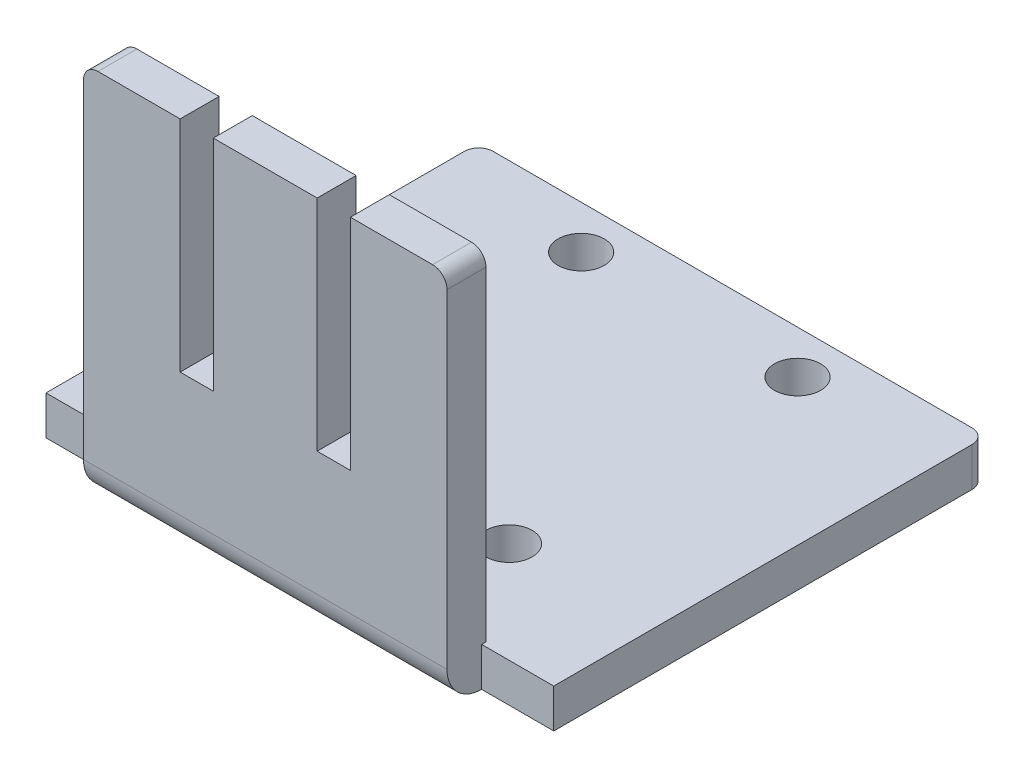
ISO-10303-21;
HEADER;
FILE_DESCRIPTION(('STEP AP214'),'2;1');
FILE_NAME('part.step','',(''),(''),'','','');
FILE_SCHEMA(('AUTOMOTIVE_DESIGN { 1 0 10303 214 1 1 1 1 }'));
ENDSEC;
DATA;
#1=APPLICATION_CONTEXT('core data for automotive mechanical design processes');
#2=APPLICATION_PROTOCOL_DEFINITION('international standard','automotive_design',2000,#1);
#3=PRODUCT_CONTEXT('',#1,'mechanical');
#4=PRODUCT('Part','Part','',(#3));
#5=PRODUCT_RELATED_PRODUCT_CATEGORY('part','',(#4));
#6=PRODUCT_DEFINITION_FORMATION('','',#4);
#7=PRODUCT_DEFINITION_CONTEXT('part definition',#1,'design');
#8=PRODUCT_DEFINITION('design','',#6,#7);
#9=PRODUCT_DEFINITION_SHAPE('','',#8);
#10=(LENGTH_UNIT() NAMED_UNIT(*) SI_UNIT(.MILLI.,.METRE.));
#11=(NAMED_UNIT(*) PLANE_ANGLE_UNIT() SI_UNIT($,.RADIAN.));
#12=(NAMED_UNIT(*) SI_UNIT($,.STERADIAN.) SOLID_ANGLE_UNIT());
#13=UNCERTAINTY_MEASURE_WITH_UNIT(LENGTH_MEASURE(1.E-05),#10,'distance_accuracy_value','');
#14=(GEOMETRIC_REPRESENTATION_CONTEXT(3) GLOBAL_UNCERTAINTY_ASSIGNED_CONTEXT((#13)) GLOBAL_UNIT_ASSIGNED_CONTEXT((#10,
#11,#12)) REPRESENTATION_CONTEXT('',''));
#15=CARTESIAN_POINT('',(0.,0.,0.));
#16=DIRECTION('',(0.,0.,1.));
#17=DIRECTION('',(1.,0.,0.));
#18=AXIS2_PLACEMENT_3D('',#15,#16,#17);
#19=CARTESIAN_POINT('',(17.6,-2.7,17.));
#20=DIRECTION('',(0.,0.,-1.));
#21=DIRECTION('',(0.,-1.,0.));
#22=AXIS2_PLACEMENT_3D('',#19,#20,#21);
#23=PLANE('',#22);
#24=DIRECTION('',(0.,-1.,0.));
#25=VECTOR('',#24,1.);
#26=CARTESIAN_POINT('',(-12.6,-2.7,17.));
#27=LINE('',#26,#25);
#28=CARTESIAN_POINT('',(-12.6,0.,17.));
#29=VERTEX_POINT('',#28);
#30=CARTESIAN_POINT('',(-12.6,-2.7,17.));
#31=VERTEX_POINT('',#30);
#32=EDGE_CURVE('E329',#29,#31,#27,.T.);
#33=ORIENTED_EDGE('',*,*,#32,.F.);
#34=DIRECTION('',(-1.,0.,0.));
#35=VECTOR('',#34,1.);
#36=CARTESIAN_POINT('',(17.6,0.,17.));
#37=LINE('',#36,#35);
#38=CARTESIAN_POINT('',(-17.6,0.,17.));
#39=VERTEX_POINT('',#38);
#40=EDGE_CURVE('E20',#29,#39,#37,.T.);
#41=ORIENTED_EDGE('',*,*,#40,.T.);
#42=DIRECTION('',(0.,1.,0.));
#43=VECTOR('',#42,1.);
#44=CARTESIAN_POINT('',(-17.6,-2.7,17.));
#45=LINE('',#44,#43);
#46=CARTESIAN_POINT('',(-17.6,-2.7,17.));
#47=VERTEX_POINT('',#46);
#48=EDGE_CURVE('E359',#47,#39,#45,.T.);
#49=ORIENTED_EDGE('',*,*,#48,.F.);
#50=DIRECTION('',(-1.,0.,0.));
#51=VECTOR('',#50,1.);
#52=CARTESIAN_POINT('',(17.6,-2.7,17.));
#53=LINE('',#52,#51);
#54=EDGE_CURVE('E344',#31,#47,#53,.T.);
#55=ORIENTED_EDGE('',*,*,#54,.F.);
#56=EDGE_LOOP('',(#33,#41,#49,#55));
#57=FACE_BOUND('',#56,.T.);
#58=ADVANCED_FACE('F17',(#57),#23,.F.);
#59=CARTESIAN_POINT('',(17.6,-2.7,17.));
#60=DIRECTION('',(0.,0.,-1.));
#61=DIRECTION('',(0.,-1.,0.));
#62=AXIS2_PLACEMENT_3D('',#59,#60,#61);
#63=PLANE('',#62);
#64=DIRECTION('',(0.,1.,0.));
#65=VECTOR('',#64,1.);
#66=CARTESIAN_POINT('',(12.6,-2.7,17.));
#67=LINE('',#66,#65);
#68=CARTESIAN_POINT('',(12.6,-2.7,17.));
#69=VERTEX_POINT('',#68);
#70=CARTESIAN_POINT('',(12.6,0.,17.));
#71=VERTEX_POINT('',#70);
#72=EDGE_CURVE('E259',#69,#71,#67,.T.);
#73=ORIENTED_EDGE('',*,*,#72,.F.);
#74=DIRECTION('',(-1.,0.,0.));
#75=VECTOR('',#74,1.);
#76=CARTESIAN_POINT('',(17.6,-2.7,17.));
#77=LINE('',#76,#75);
#78=CARTESIAN_POINT('',(17.6,-2.7,17.));
#79=VERTEX_POINT('',#78);
#80=EDGE_CURVE('E341',#79,#69,#77,.T.);
#81=ORIENTED_EDGE('',*,*,#80,.F.);
#82=DIRECTION('',(0.,1.,0.));
#83=VECTOR('',#82,1.);
#84=CARTESIAN_POINT('',(17.6,-2.7,17.));
#85=LINE('',#84,#83);
#86=CARTESIAN_POINT('',(17.6,0.,17.));
#87=VERTEX_POINT('',#86);
#88=EDGE_CURVE('E267',#79,#87,#85,.T.);
#89=ORIENTED_EDGE('',*,*,#88,.T.);
#90=DIRECTION('',(-1.,0.,0.));
#91=VECTOR('',#90,1.);
#92=CARTESIAN_POINT('',(17.6,0.,17.));
#93=LINE('',#92,#91);
#94=EDGE_CURVE('E11',#87,#71,#93,.T.);
#95=ORIENTED_EDGE('',*,*,#94,.T.);
#96=EDGE_LOOP('',(#73,#81,#89,#95));
#97=FACE_BOUND('',#96,.T.);
#98=ADVANCED_FACE('F453',(#97),#63,.F.);
#99=CARTESIAN_POINT('',(7.5,0.,-10.));
#100=DIRECTION('',(0.,-1.,0.));
#101=DIRECTION('',(0.,0.,-1.));
#102=AXIS2_PLACEMENT_3D('',#99,#100,#101);
#103=PLANE('',#102);
#104=CARTESIAN_POINT('',(7.5,0.,10.));
#105=DIRECTION('',(0.,-1.,0.));
#106=DIRECTION('',(1.,0.,0.));
#107=AXIS2_PLACEMENT_3D('',#104,#105,#106);
#108=CIRCLE('',#107,1.6);
#109=CARTESIAN_POINT('',(9.1,0.,10.));
#110=VERTEX_POINT('',#109);
#111=EDGE_CURVE('E469',#110,#110,#108,.T.);
#112=ORIENTED_EDGE('',*,*,#111,.T.);
#113=EDGE_LOOP('',(#112));
#114=FACE_BOUND('',#113,.T.);
#115=CARTESIAN_POINT('',(-7.5,0.,10.));
#116=DIRECTION('',(0.,-1.,0.));
#117=DIRECTION('',(1.,0.,0.));
#118=AXIS2_PLACEMENT_3D('',#115,#116,#117);
#119=CIRCLE('',#118,1.6);
#120=CARTESIAN_POINT('',(-5.9,0.,10.));
#121=VERTEX_POINT('',#120);
#122=EDGE_CURVE('E511',#121,#121,#119,.T.);
#123=ORIENTED_EDGE('',*,*,#122,.T.);
#124=EDGE_LOOP('',(#123));
#125=FACE_BOUND('',#124,.T.);
#126=CARTESIAN_POINT('',(-7.5,0.,-10.));
#127=DIRECTION('',(0.,-1.,0.));
#128=DIRECTION('',(1.,0.,0.));
#129=AXIS2_PLACEMENT_3D('',#126,#127,#128);
#130=CIRCLE('',#129,1.6);
#131=CARTESIAN_POINT('',(-5.9,0.,-10.));
#132=VERTEX_POINT('',#131);
#133=EDGE_CURVE('E510',#132,#132,#130,.T.);
#134=ORIENTED_EDGE('',*,*,#133,.T.);
#135=EDGE_LOOP('',(#134));
#136=FACE_BOUND('',#135,.T.);
#137=CARTESIAN_POINT('',(7.5,0.,-10.));
#138=DIRECTION('',(0.,-1.,0.));
#139=DIRECTION('',(1.,0.,0.));
#140=AXIS2_PLACEMENT_3D('',#137,#138,#139);
#141=CIRCLE('',#140,1.6);
#142=CARTESIAN_POINT('',(9.1,0.,-10.));
#143=VERTEX_POINT('',#142);
#144=EDGE_CURVE('E518',#143,#143,#141,.T.);
#145=ORIENTED_EDGE('',*,*,#144,.T.);
#146=EDGE_LOOP('',(#145));
#147=FACE_BOUND('',#146,.T.);
#148=DIRECTION('',(1.,0.,0.));
#149=VECTOR('',#148,1.);
#150=CARTESIAN_POINT('',(-17.6,0.,-13.));
#151=LINE('',#150,#149);
#152=CARTESIAN_POINT('',(-16.6,0.,-13.));
#153=VERTEX_POINT('',#152);
#154=CARTESIAN_POINT('',(16.6,0.,-13.));
#155=VERTEX_POINT('',#154);
#156=EDGE_CURVE('E270',#153,#155,#151,.T.);
#157=ORIENTED_EDGE('',*,*,#156,.F.);
#158=CARTESIAN_POINT('',(-16.6,0.,-12.));
#159=DIRECTION('',(0.,1.,0.));
#160=DIRECTION('',(0.,0.,-1.));
#161=AXIS2_PLACEMENT_3D('',#158,#159,#160);
#162=CIRCLE('',#161,1.);
#163=CARTESIAN_POINT('',(-17.6,0.,-12.));
#164=VERTEX_POINT('',#163);
#165=EDGE_CURVE('E403',#153,#164,#162,.T.);
#166=ORIENTED_EDGE('',*,*,#165,.T.);
#167=DIRECTION('',(0.,0.,-1.));
#168=VECTOR('',#167,1.);
#169=CARTESIAN_POINT('',(-17.6,0.,17.));
#170=LINE('',#169,#168);
#171=EDGE_CURVE('E351',#39,#164,#170,.T.);
#172=ORIENTED_EDGE('',*,*,#171,.F.);
#173=ORIENTED_EDGE('',*,*,#40,.F.);
#174=DIRECTION('',(0.,0.,1.));
#175=VECTOR('',#174,1.);
#176=CARTESIAN_POINT('',(-12.6,0.,-10.));
#177=LINE('',#176,#175);
#178=CARTESIAN_POINT('',(-12.6,0.,16.7));
#179=VERTEX_POINT('',#178);
#180=EDGE_CURVE('E258',#179,#29,#177,.T.);
#181=ORIENTED_EDGE('',*,*,#180,.F.);
#182=DIRECTION('',(-1.,0.,0.));
#183=VECTOR('',#182,1.);
#184=CARTESIAN_POINT('',(7.5,0.,16.7));
#185=LINE('',#184,#183);
#186=CARTESIAN_POINT('',(12.6,0.,16.7));
#187=VERTEX_POINT('',#186);
#188=EDGE_CURVE('E318',#187,#179,#185,.T.);
#189=ORIENTED_EDGE('',*,*,#188,.F.);
#190=DIRECTION('',(0.,0.,-1.));
#191=VECTOR('',#190,1.);
#192=CARTESIAN_POINT('',(12.6,0.,-10.));
#193=LINE('',#192,#191);
#194=EDGE_CURVE('E256',#71,#187,#193,.T.);
#195=ORIENTED_EDGE('',*,*,#194,.F.);
#196=ORIENTED_EDGE('',*,*,#94,.F.);
#197=DIRECTION('',(0.,0.,1.));
#198=VECTOR('',#197,1.);
#199=CARTESIAN_POINT('',(17.6,0.,-13.));
#200=LINE('',#199,#198);
#201=CARTESIAN_POINT('',(17.6,0.,-12.));
#202=VERTEX_POINT('',#201);
#203=EDGE_CURVE('E271',#202,#87,#200,.T.);
#204=ORIENTED_EDGE('',*,*,#203,.F.);
#205=CARTESIAN_POINT('',(16.6,0.,-12.));
#206=DIRECTION('',(0.,1.,0.));
#207=DIRECTION('',(0.,0.,-1.));
#208=AXIS2_PLACEMENT_3D('',#205,#206,#207);
#209=CIRCLE('',#208,1.);
#210=EDGE_CURVE('E384',#202,#155,#209,.T.);
#211=ORIENTED_EDGE('',*,*,#210,.T.);
#212=EDGE_LOOP('',(#157,#166,#172,#173,#181,#189,#195,#196,#204,#211));
#213=FACE_BOUND('',#212,.T.);
#214=ADVANCED_FACE('F542',(#114,#125,#136,#147,#213),#103,.F.);
#215=CARTESIAN_POINT('',(-17.6,-2.7,17.));
#216=DIRECTION('',(1.,0.,0.));
#217=DIRECTION('',(0.,0.,-1.));
#218=AXIS2_PLACEMENT_3D('',#215,#216,#217);
#219=PLANE('',#218);
#220=ORIENTED_EDGE('',*,*,#171,.T.);
#221=DIRECTION('',(0.,-1.,0.));
#222=VECTOR('',#221,1.);
#223=CARTESIAN_POINT('',(-17.6,-2.7,-12.));
#224=LINE('',#223,#222);
#225=CARTESIAN_POINT('',(-17.6,-2.7,-12.));
#226=VERTEX_POINT('',#225);
#227=EDGE_CURVE('E400',#164,#226,#224,.T.);
#228=ORIENTED_EDGE('',*,*,#227,.T.);
#229=DIRECTION('',(0.,0.,-1.));
#230=VECTOR('',#229,1.);
#231=CARTESIAN_POINT('',(-17.6,-2.7,17.));
#232=LINE('',#231,#230);
#233=EDGE_CURVE('E333',#47,#226,#232,.T.);
#234=ORIENTED_EDGE('',*,*,#233,.F.);
#235=ORIENTED_EDGE('',*,*,#48,.T.);
#236=EDGE_LOOP('',(#220,#228,#234,#235));
#237=FACE_BOUND('',#236,.T.);
#238=ADVANCED_FACE('F583',(#237),#219,.F.);
#239=CARTESIAN_POINT('',(-17.6,-2.7,-13.));
#240=DIRECTION('',(0.,0.,1.));
#241=DIRECTION('',(1.,0.,0.));
#242=AXIS2_PLACEMENT_3D('',#239,#240,#241);
#243=PLANE('',#242);
#244=DIRECTION('',(1.,0.,0.));
#245=VECTOR('',#244,1.);
#246=CARTESIAN_POINT('',(-17.6,-2.7,-13.));
#247=LINE('',#246,#245);
#248=CARTESIAN_POINT('',(-16.6,-2.7,-13.));
#249=VERTEX_POINT('',#248);
#250=CARTESIAN_POINT('',(16.6,-2.7,-13.));
#251=VERTEX_POINT('',#250);
#252=EDGE_CURVE('E336',#249,#251,#247,.T.);
#253=ORIENTED_EDGE('',*,*,#252,.F.);
#254=DIRECTION('',(0.,1.,0.));
#255=VECTOR('',#254,1.);
#256=CARTESIAN_POINT('',(-16.6,-2.7,-13.));
#257=LINE('',#256,#255);
#258=EDGE_CURVE('E406',#249,#153,#257,.T.);
#259=ORIENTED_EDGE('',*,*,#258,.T.);
#260=ORIENTED_EDGE('',*,*,#156,.T.);
#261=DIRECTION('',(0.,-1.,0.));
#262=VECTOR('',#261,1.);
#263=CARTESIAN_POINT('',(16.6,-2.7,-13.));
#264=LINE('',#263,#262);
#265=EDGE_CURVE('E381',#155,#251,#264,.T.);
#266=ORIENTED_EDGE('',*,*,#265,.T.);
#267=EDGE_LOOP('',(#253,#259,#260,#266));
#268=FACE_BOUND('',#267,.T.);
#269=ADVANCED_FACE('F604',(#268),#243,.F.);
#270=CARTESIAN_POINT('',(17.6,-2.7,-13.));
#271=DIRECTION('',(-1.,0.,0.));
#272=DIRECTION('',(0.,0.,1.));
#273=AXIS2_PLACEMENT_3D('',#270,#271,#272);
#274=PLANE('',#273);
#275=DIRECTION('',(0.,0.,1.));
#276=VECTOR('',#275,1.);
#277=CARTESIAN_POINT('',(17.6,-2.7,-13.));
#278=LINE('',#277,#276);
#279=CARTESIAN_POINT('',(17.6,-2.7,-12.));
#280=VERTEX_POINT('',#279);
#281=EDGE_CURVE('E337',#280,#79,#278,.T.);
#282=ORIENTED_EDGE('',*,*,#281,.F.);
#283=DIRECTION('',(0.,1.,0.));
#284=VECTOR('',#283,1.);
#285=CARTESIAN_POINT('',(17.6,-2.7,-12.));
#286=LINE('',#285,#284);
#287=EDGE_CURVE('E392',#280,#202,#286,.T.);
#288=ORIENTED_EDGE('',*,*,#287,.T.);
#289=ORIENTED_EDGE('',*,*,#203,.T.);
#290=ORIENTED_EDGE('',*,*,#88,.F.);
#291=EDGE_LOOP('',(#282,#288,#289,#290));
#292=FACE_BOUND('',#291,.T.);
#293=ADVANCED_FACE('F554',(#292),#274,.F.);
#294=CARTESIAN_POINT('',(7.5,-2.7,-10.));
#295=DIRECTION('',(0.,-1.,0.));
#296=DIRECTION('',(0.,0.,-1.));
#297=AXIS2_PLACEMENT_3D('',#294,#295,#296);
#298=PLANE('',#297);
#299=CARTESIAN_POINT('',(7.5,-2.7,-10.));
#300=DIRECTION('',(0.,-1.,0.));
#301=DIRECTION('',(1.,0.,0.));
#302=AXIS2_PLACEMENT_3D('',#299,#300,#301);
#303=CIRCLE('',#302,1.6);
#304=CARTESIAN_POINT('',(9.1,-2.7,-10.));
#305=VERTEX_POINT('',#304);
#306=EDGE_CURVE('E527',#305,#305,#303,.T.);
#307=ORIENTED_EDGE('',*,*,#306,.F.);
#308=EDGE_LOOP('',(#307));
#309=FACE_BOUND('',#308,.T.);
#310=CARTESIAN_POINT('',(-7.5,-2.7,-10.));
#311=DIRECTION('',(0.,-1.,0.));
#312=DIRECTION('',(1.,0.,0.));
#313=AXIS2_PLACEMENT_3D('',#310,#311,#312);
#314=CIRCLE('',#313,1.6);
#315=CARTESIAN_POINT('',(-5.9,-2.7,-10.));
#316=VERTEX_POINT('',#315);
#317=EDGE_CURVE('E506',#316,#316,#314,.T.);
#318=ORIENTED_EDGE('',*,*,#317,.F.);
#319=EDGE_LOOP('',(#318));
#320=FACE_BOUND('',#319,.T.);
#321=CARTESIAN_POINT('',(-7.5,-2.7,10.));
#322=DIRECTION('',(0.,-1.,0.));
#323=DIRECTION('',(1.,0.,0.));
#324=AXIS2_PLACEMENT_3D('',#321,#322,#323);
#325=CIRCLE('',#324,1.6);
#326=CARTESIAN_POINT('',(-5.9,-2.7,10.));
#327=VERTEX_POINT('',#326);
#328=EDGE_CURVE('E561',#327,#327,#325,.T.);
#329=ORIENTED_EDGE('',*,*,#328,.F.);
#330=EDGE_LOOP('',(#329));
#331=FACE_BOUND('',#330,.T.);
#332=CARTESIAN_POINT('',(7.5,-2.7,10.));
#333=DIRECTION('',(0.,-1.,0.));
#334=DIRECTION('',(1.,0.,0.));
#335=AXIS2_PLACEMENT_3D('',#332,#333,#334);
#336=CIRCLE('',#335,1.6);
#337=CARTESIAN_POINT('',(9.1,-2.7,10.));
#338=VERTEX_POINT('',#337);
#339=EDGE_CURVE('E476',#338,#338,#336,.T.);
#340=ORIENTED_EDGE('',*,*,#339,.F.);
#341=EDGE_LOOP('',(#340));
#342=FACE_BOUND('',#341,.T.);
#343=ORIENTED_EDGE('',*,*,#233,.T.);
#344=CARTESIAN_POINT('',(-16.6,-2.7,-12.));
#345=DIRECTION('',(0.,-1.,0.));
#346=DIRECTION('',(0.,0.,-1.));
#347=AXIS2_PLACEMENT_3D('',#344,#345,#346);
#348=CIRCLE('',#347,1.);
#349=EDGE_CURVE('E396',#226,#249,#348,.T.);
#350=ORIENTED_EDGE('',*,*,#349,.T.);
#351=ORIENTED_EDGE('',*,*,#252,.T.);
#352=CARTESIAN_POINT('',(16.6,-2.7,-12.));
#353=DIRECTION('',(0.,-1.,0.));
#354=DIRECTION('',(0.,0.,-1.));
#355=AXIS2_PLACEMENT_3D('',#352,#353,#354);
#356=CIRCLE('',#355,1.);
#357=EDGE_CURVE('E377',#251,#280,#356,.T.);
#358=ORIENTED_EDGE('',*,*,#357,.T.);
#359=ORIENTED_EDGE('',*,*,#281,.T.);
#360=ORIENTED_EDGE('',*,*,#80,.T.);
#361=DIRECTION('',(-1.,0.,0.));
#362=VECTOR('',#361,1.);
#363=CARTESIAN_POINT('',(7.5,-2.7,17.));
#364=LINE('',#363,#362);
#365=EDGE_CURVE('E413',#69,#31,#364,.T.);
#366=ORIENTED_EDGE('',*,*,#365,.T.);
#367=ORIENTED_EDGE('',*,*,#54,.T.);
#368=EDGE_LOOP('',(#343,#350,#351,#358,#359,#360,#366,#367));
#369=FACE_BOUND('',#368,.T.);
#370=ADVANCED_FACE('F447',(#309,#320,#331,#342,#369),#298,.T.);
#371=CARTESIAN_POINT('',(-12.6,23.5,19.4));
#372=DIRECTION('',(1.,0.,0.));
#373=DIRECTION('',(0.,1.,0.));
#374=AXIS2_PLACEMENT_3D('',#371,#372,#373);
#375=PLANE('',#374);
#376=DIRECTION('',(0.,-1.,0.));
#377=VECTOR('',#376,1.);
#378=CARTESIAN_POINT('',(-12.6,23.5,19.4));
#379=LINE('',#378,#377);
#380=CARTESIAN_POINT('',(-12.6,22.5,19.4));
#381=VERTEX_POINT('',#380);
#382=CARTESIAN_POINT('',(-12.6,-0.3,19.4));
#383=VERTEX_POINT('',#382);
#384=EDGE_CURVE('E251',#381,#383,#379,.T.);
#385=ORIENTED_EDGE('',*,*,#384,.F.);
#386=DIRECTION('',(0.,0.,-1.));
#387=VECTOR('',#386,1.);
#388=CARTESIAN_POINT('',(-12.6,22.5,19.4));
#389=LINE('',#388,#387);
#390=CARTESIAN_POINT('',(-12.6,22.5,16.7));
#391=VERTEX_POINT('',#390);
#392=EDGE_CURVE('E373',#381,#391,#389,.T.);
#393=ORIENTED_EDGE('',*,*,#392,.T.);
#394=DIRECTION('',(0.,-1.,0.));
#395=VECTOR('',#394,1.);
#396=CARTESIAN_POINT('',(-12.6,23.5,16.7));
#397=LINE('',#396,#395);
#398=EDGE_CURVE('E317',#391,#179,#397,.T.);
#399=ORIENTED_EDGE('',*,*,#398,.T.);
#400=ORIENTED_EDGE('',*,*,#180,.T.);
#401=ORIENTED_EDGE('',*,*,#32,.T.);
#402=CARTESIAN_POINT('',(-12.6,-0.3,17.));
#403=DIRECTION('',(-1.,0.,0.));
#404=DIRECTION('',(0.,1.,0.));
#405=AXIS2_PLACEMENT_3D('',#402,#403,#404);
#406=CIRCLE('',#405,2.4);
#407=EDGE_CURVE('E409',#31,#383,#406,.T.);
#408=ORIENTED_EDGE('',*,*,#407,.T.);
#409=EDGE_LOOP('',(#385,#393,#399,#400,#401,#408));
#410=FACE_BOUND('',#409,.T.);
#411=ADVANCED_FACE('F445',(#410),#375,.F.);
#412=CARTESIAN_POINT('',(12.6,-2.7,19.4));
#413=DIRECTION('',(-1.,0.,0.));
#414=DIRECTION('',(0.,0.,1.));
#415=AXIS2_PLACEMENT_3D('',#412,#413,#414);
#416=PLANE('',#415);
#417=DIRECTION('',(0.,1.,0.));
#418=VECTOR('',#417,1.);
#419=CARTESIAN_POINT('',(12.6,-2.7,16.7));
#420=LINE('',#419,#418);
#421=CARTESIAN_POINT('',(12.6,22.5,16.7));
#422=VERTEX_POINT('',#421);
#423=EDGE_CURVE('E322',#187,#422,#420,.T.);
#424=ORIENTED_EDGE('',*,*,#423,.T.);
#425=DIRECTION('',(0.,0.,1.));
#426=VECTOR('',#425,1.);
#427=CARTESIAN_POINT('',(12.6,22.5,19.4));
#428=LINE('',#427,#426);
#429=CARTESIAN_POINT('',(12.6,22.5,19.4));
#430=VERTEX_POINT('',#429);
#431=EDGE_CURVE('E458',#422,#430,#428,.T.);
#432=ORIENTED_EDGE('',*,*,#431,.T.);
#433=DIRECTION('',(0.,1.,0.));
#434=VECTOR('',#433,1.);
#435=CARTESIAN_POINT('',(12.6,-2.7,19.4));
#436=LINE('',#435,#434);
#437=CARTESIAN_POINT('',(12.6,-0.3,19.4));
#438=VERTEX_POINT('',#437);
#439=EDGE_CURVE('E245',#438,#430,#436,.T.);
#440=ORIENTED_EDGE('',*,*,#439,.F.);
#441=CARTESIAN_POINT('',(12.6,-0.3,17.));
#442=DIRECTION('',(1.,0.,0.));
#443=DIRECTION('',(0.,-1.,0.));
#444=AXIS2_PLACEMENT_3D('',#441,#442,#443);
#445=CIRCLE('',#444,2.4);
#446=EDGE_CURVE('E417',#438,#69,#445,.T.);
#447=ORIENTED_EDGE('',*,*,#446,.T.);
#448=ORIENTED_EDGE('',*,*,#72,.T.);
#449=ORIENTED_EDGE('',*,*,#194,.T.);
#450=EDGE_LOOP('',(#424,#432,#440,#447,#448,#449));
#451=FACE_BOUND('',#450,.T.);
#452=ADVANCED_FACE('F455',(#451),#416,.F.);
#453=CARTESIAN_POINT('',(0.,0.,16.7));
#454=DIRECTION('',(0.,0.,1.));
#455=DIRECTION('',(1.,0.,0.));
#456=AXIS2_PLACEMENT_3D('',#453,#454,#455);
#457=PLANE('',#456);
#458=ORIENTED_EDGE('',*,*,#398,.F.);
#459=CARTESIAN_POINT('',(-11.6,22.5,16.7));
#460=DIRECTION('',(0.,0.,-1.));
#461=DIRECTION('',(1.,0.,0.));
#462=AXIS2_PLACEMENT_3D('',#459,#460,#461);
#463=CIRCLE('',#462,1.);
#464=CARTESIAN_POINT('',(-11.6,23.5,16.7));
#465=VERTEX_POINT('',#464);
#466=EDGE_CURVE('E378',#391,#465,#463,.T.);
#467=ORIENTED_EDGE('',*,*,#466,.T.);
#468=DIRECTION('',(-1.,0.,0.));
#469=VECTOR('',#468,1.);
#470=CARTESIAN_POINT('',(-5.9,23.5,16.7));
#471=LINE('',#470,#469);
#472=CARTESIAN_POINT('',(-5.9,23.5,16.7));
#473=VERTEX_POINT('',#472);
#474=EDGE_CURVE('E255',#473,#465,#471,.T.);
#475=ORIENTED_EDGE('',*,*,#474,.F.);
#476=DIRECTION('',(0.,1.,0.));
#477=VECTOR('',#476,1.);
#478=CARTESIAN_POINT('',(-5.9,8.3,16.7));
#479=LINE('',#478,#477);
#480=CARTESIAN_POINT('',(-5.9,8.3,16.7));
#481=VERTEX_POINT('',#480);
#482=EDGE_CURVE('E280',#481,#473,#479,.T.);
#483=ORIENTED_EDGE('',*,*,#482,.F.);
#484=DIRECTION('',(-1.,0.,0.));
#485=VECTOR('',#484,1.);
#486=CARTESIAN_POINT('',(-3.6,8.3,16.7));
#487=LINE('',#486,#485);
#488=CARTESIAN_POINT('',(-3.6,8.3,16.7));
#489=VERTEX_POINT('',#488);
#490=EDGE_CURVE('E285',#489,#481,#487,.T.);
#491=ORIENTED_EDGE('',*,*,#490,.F.);
#492=DIRECTION('',(0.,-1.,0.));
#493=VECTOR('',#492,1.);
#494=CARTESIAN_POINT('',(-3.6,23.5,16.7));
#495=LINE('',#494,#493);
#496=CARTESIAN_POINT('',(-3.6,23.5,16.7));
#497=VERTEX_POINT('',#496);
#498=EDGE_CURVE('E292',#497,#489,#495,.T.);
#499=ORIENTED_EDGE('',*,*,#498,.F.);
#500=DIRECTION('',(-1.,0.,0.));
#501=VECTOR('',#500,1.);
#502=CARTESIAN_POINT('',(3.6,23.5,16.7));
#503=LINE('',#502,#501);
#504=CARTESIAN_POINT('',(3.6,23.5,16.7));
#505=VERTEX_POINT('',#504);
#506=EDGE_CURVE('E296',#505,#497,#503,.T.);
#507=ORIENTED_EDGE('',*,*,#506,.F.);
#508=DIRECTION('',(0.,1.,0.));
#509=VECTOR('',#508,1.);
#510=CARTESIAN_POINT('',(3.6,8.3,16.7));
#511=LINE('',#510,#509);
#512=CARTESIAN_POINT('',(3.6,8.3,16.7));
#513=VERTEX_POINT('',#512);
#514=EDGE_CURVE('E303',#513,#505,#511,.T.);
#515=ORIENTED_EDGE('',*,*,#514,.F.);
#516=DIRECTION('',(-1.,0.,0.));
#517=VECTOR('',#516,1.);
#518=CARTESIAN_POINT('',(5.9,8.3,16.7));
#519=LINE('',#518,#517);
#520=CARTESIAN_POINT('',(5.9,8.3,16.7));
#521=VERTEX_POINT('',#520);
#522=EDGE_CURVE('E310',#521,#513,#519,.T.);
#523=ORIENTED_EDGE('',*,*,#522,.F.);
#524=DIRECTION('',(0.,-1.,0.));
#525=VECTOR('',#524,1.);
#526=CARTESIAN_POINT('',(5.9,23.5,16.7));
#527=LINE('',#526,#525);
#528=CARTESIAN_POINT('',(5.9,23.5,16.7));
#529=VERTEX_POINT('',#528);
#530=EDGE_CURVE('E227',#529,#521,#527,.T.);
#531=ORIENTED_EDGE('',*,*,#530,.F.);
#532=DIRECTION('',(-1.,0.,0.));
#533=VECTOR('',#532,1.);
#534=CARTESIAN_POINT('',(12.6,23.5,16.7));
#535=LINE('',#534,#533);
#536=CARTESIAN_POINT('',(11.6,23.5,16.7));
#537=VERTEX_POINT('',#536);
#538=EDGE_CURVE('E223',#537,#529,#535,.T.);
#539=ORIENTED_EDGE('',*,*,#538,.F.);
#540=CARTESIAN_POINT('',(11.6,22.5,16.7));
#541=DIRECTION('',(0.,0.,-1.));
#542=DIRECTION('',(1.,0.,0.));
#543=AXIS2_PLACEMENT_3D('',#540,#541,#542);
#544=CIRCLE('',#543,1.);
#545=EDGE_CURVE('E464',#537,#422,#544,.T.);
#546=ORIENTED_EDGE('',*,*,#545,.T.);
#547=ORIENTED_EDGE('',*,*,#423,.F.);
#548=ORIENTED_EDGE('',*,*,#188,.T.);
#549=EDGE_LOOP('',(#458,#467,#475,#483,#491,#499,#507,#515,#523,#531,#539,#546,#547,#548));
#550=FACE_BOUND('',#549,.T.);
#551=ADVANCED_FACE('F595',(#550),#457,.F.);
#552=CARTESIAN_POINT('',(12.6,23.5,19.4));
#553=DIRECTION('',(0.,-1.,0.));
#554=DIRECTION('',(0.,0.,-1.));
#555=AXIS2_PLACEMENT_3D('',#552,#553,#554);
#556=PLANE('',#555);
#557=DIRECTION('',(-1.,0.,0.));
#558=VECTOR('',#557,1.);
#559=CARTESIAN_POINT('',(12.6,23.5,19.4));
#560=LINE('',#559,#558);
#561=CARTESIAN_POINT('',(11.6,23.5,19.4));
#562=VERTEX_POINT('',#561);
#563=CARTESIAN_POINT('',(5.9,23.5,19.4));
#564=VERTEX_POINT('',#563);
#565=EDGE_CURVE('E221',#562,#564,#560,.T.);
#566=ORIENTED_EDGE('',*,*,#565,.F.);
#567=DIRECTION('',(0.,0.,-1.));
#568=VECTOR('',#567,1.);
#569=CARTESIAN_POINT('',(11.6,23.5,19.4));
#570=LINE('',#569,#568);
#571=EDGE_CURVE('E467',#562,#537,#570,.T.);
#572=ORIENTED_EDGE('',*,*,#571,.T.);
#573=ORIENTED_EDGE('',*,*,#538,.T.);
#574=DIRECTION('',(0.,0.,-1.));
#575=VECTOR('',#574,1.);
#576=CARTESIAN_POINT('',(5.9,23.5,19.4));
#577=LINE('',#576,#575);
#578=EDGE_CURVE('E216',#564,#529,#577,.T.);
#579=ORIENTED_EDGE('',*,*,#578,.F.);
#580=EDGE_LOOP('',(#566,#572,#573,#579));
#581=FACE_BOUND('',#580,.T.);
#582=ADVANCED_FACE('F218',(#581),#556,.F.);
#583=CARTESIAN_POINT('',(5.9,23.5,19.4));
#584=DIRECTION('',(1.,0.,0.));
#585=DIRECTION('',(0.,1.,0.));
#586=AXIS2_PLACEMENT_3D('',#583,#584,#585);
#587=PLANE('',#586);
#588=ORIENTED_EDGE('',*,*,#530,.T.);
#589=DIRECTION('',(0.,0.,-1.));
#590=VECTOR('',#589,1.);
#591=CARTESIAN_POINT('',(5.9,8.3,19.4));
#592=LINE('',#591,#590);
#593=CARTESIAN_POINT('',(5.9,8.3,19.4));
#594=VERTEX_POINT('',#593);
#595=EDGE_CURVE('E233',#594,#521,#592,.T.);
#596=ORIENTED_EDGE('',*,*,#595,.F.);
#597=DIRECTION('',(0.,-1.,0.));
#598=VECTOR('',#597,1.);
#599=CARTESIAN_POINT('',(5.9,23.5,19.4));
#600=LINE('',#599,#598);
#601=EDGE_CURVE('E230',#564,#594,#600,.T.);
#602=ORIENTED_EDGE('',*,*,#601,.F.);
#603=ORIENTED_EDGE('',*,*,#578,.T.);
#604=EDGE_LOOP('',(#588,#596,#602,#603));
#605=FACE_BOUND('',#604,.T.);
#606=ADVANCED_FACE('F231',(#605),#587,.F.);
#607=CARTESIAN_POINT('',(5.9,8.3,19.4));
#608=DIRECTION('',(0.,-1.,0.));
#609=DIRECTION('',(0.,0.,-1.));
#610=AXIS2_PLACEMENT_3D('',#607,#608,#609);
#611=PLANE('',#610);
#612=ORIENTED_EDGE('',*,*,#522,.T.);
#613=DIRECTION('',(0.,0.,-1.));
#614=VECTOR('',#613,1.);
#615=CARTESIAN_POINT('',(3.6,8.3,19.4));
#616=LINE('',#615,#614);
#617=CARTESIAN_POINT('',(3.6,8.3,19.4));
#618=VERTEX_POINT('',#617);
#619=EDGE_CURVE('E306',#618,#513,#616,.T.);
#620=ORIENTED_EDGE('',*,*,#619,.F.);
#621=DIRECTION('',(-1.,0.,0.));
#622=VECTOR('',#621,1.);
#623=CARTESIAN_POINT('',(5.9,8.3,19.4));
#624=LINE('',#623,#622);
#625=EDGE_CURVE('E238',#594,#618,#624,.T.);
#626=ORIENTED_EDGE('',*,*,#625,.F.);
#627=ORIENTED_EDGE('',*,*,#595,.T.);
#628=EDGE_LOOP('',(#612,#620,#626,#627));
#629=FACE_BOUND('',#628,.T.);
#630=ADVANCED_FACE('F588',(#629),#611,.F.);
#631=CARTESIAN_POINT('',(3.6,8.3,19.4));
#632=DIRECTION('',(-1.,0.,0.));
#633=DIRECTION('',(0.,0.,1.));
#634=AXIS2_PLACEMENT_3D('',#631,#632,#633);
#635=PLANE('',#634);
#636=ORIENTED_EDGE('',*,*,#514,.T.);
#637=DIRECTION('',(0.,0.,-1.));
#638=VECTOR('',#637,1.);
#639=CARTESIAN_POINT('',(3.6,23.5,19.4));
#640=LINE('',#639,#638);
#641=CARTESIAN_POINT('',(3.6,23.5,19.4));
#642=VERTEX_POINT('',#641);
#643=EDGE_CURVE('E299',#642,#505,#640,.T.);
#644=ORIENTED_EDGE('',*,*,#643,.F.);
#645=DIRECTION('',(0.,1.,0.));
#646=VECTOR('',#645,1.);
#647=CARTESIAN_POINT('',(3.6,8.3,19.4));
#648=LINE('',#647,#646);
#649=EDGE_CURVE('E265',#618,#642,#648,.T.);
#650=ORIENTED_EDGE('',*,*,#649,.F.);
#651=ORIENTED_EDGE('',*,*,#619,.T.);
#652=EDGE_LOOP('',(#636,#644,#650,#651));
#653=FACE_BOUND('',#652,.T.);
#654=ADVANCED_FACE('F591',(#653),#635,.F.);
#655=CARTESIAN_POINT('',(3.6,23.5,19.4));
#656=DIRECTION('',(0.,-1.,0.));
#657=DIRECTION('',(0.,0.,-1.));
#658=AXIS2_PLACEMENT_3D('',#655,#656,#657);
#659=PLANE('',#658);
#660=ORIENTED_EDGE('',*,*,#506,.T.);
#661=DIRECTION('',(0.,0.,-1.));
#662=VECTOR('',#661,1.);
#663=CARTESIAN_POINT('',(-3.6,23.5,19.4));
#664=LINE('',#663,#662);
#665=CARTESIAN_POINT('',(-3.6,23.5,19.4));
#666=VERTEX_POINT('',#665);
#667=EDGE_CURVE('E295',#666,#497,#664,.T.);
#668=ORIENTED_EDGE('',*,*,#667,.F.);
#669=DIRECTION('',(-1.,0.,0.));
#670=VECTOR('',#669,1.);
#671=CARTESIAN_POINT('',(3.6,23.5,19.4));
#672=LINE('',#671,#670);
#673=EDGE_CURVE('E261',#642,#666,#672,.T.);
#674=ORIENTED_EDGE('',*,*,#673,.F.);
#675=ORIENTED_EDGE('',*,*,#643,.T.);
#676=EDGE_LOOP('',(#660,#668,#674,#675));
#677=FACE_BOUND('',#676,.T.);
#678=ADVANCED_FACE('F670',(#677),#659,.F.);
#679=CARTESIAN_POINT('',(-3.6,23.5,19.4));
#680=DIRECTION('',(1.,0.,0.));
#681=DIRECTION('',(0.,1.,0.));
#682=AXIS2_PLACEMENT_3D('',#679,#680,#681);
#683=PLANE('',#682);
#684=ORIENTED_EDGE('',*,*,#498,.T.);
#685=DIRECTION('',(0.,0.,-1.));
#686=VECTOR('',#685,1.);
#687=CARTESIAN_POINT('',(-3.6,8.3,19.4));
#688=LINE('',#687,#686);
#689=CARTESIAN_POINT('',(-3.6,8.3,19.4));
#690=VERTEX_POINT('',#689);
#691=EDGE_CURVE('E288',#690,#489,#688,.T.);
#692=ORIENTED_EDGE('',*,*,#691,.F.);
#693=DIRECTION('',(0.,-1.,0.));
#694=VECTOR('',#693,1.);
#695=CARTESIAN_POINT('',(-3.6,23.5,19.4));
#696=LINE('',#695,#694);
#697=EDGE_CURVE('E264',#666,#690,#696,.T.);
#698=ORIENTED_EDGE('',*,*,#697,.F.);
#699=ORIENTED_EDGE('',*,*,#667,.T.);
#700=EDGE_LOOP('',(#684,#692,#698,#699));
#701=FACE_BOUND('',#700,.T.);
#702=ADVANCED_FACE('F678',(#701),#683,.F.);
#703=CARTESIAN_POINT('',(-3.6,8.3,19.4));
#704=DIRECTION('',(0.,-1.,0.));
#705=DIRECTION('',(0.,0.,-1.));
#706=AXIS2_PLACEMENT_3D('',#703,#704,#705);
#707=PLANE('',#706);
#708=ORIENTED_EDGE('',*,*,#490,.T.);
#709=DIRECTION('',(0.,0.,-1.));
#710=VECTOR('',#709,1.);
#711=CARTESIAN_POINT('',(-5.9,8.3,19.4));
#712=LINE('',#711,#710);
#713=CARTESIAN_POINT('',(-5.9,8.3,19.4));
#714=VERTEX_POINT('',#713);
#715=EDGE_CURVE('E283',#714,#481,#712,.T.);
#716=ORIENTED_EDGE('',*,*,#715,.F.);
#717=DIRECTION('',(-1.,0.,0.));
#718=VECTOR('',#717,1.);
#719=CARTESIAN_POINT('',(-3.6,8.3,19.4));
#720=LINE('',#719,#718);
#721=EDGE_CURVE('E275',#690,#714,#720,.T.);
#722=ORIENTED_EDGE('',*,*,#721,.F.);
#723=ORIENTED_EDGE('',*,*,#691,.T.);
#724=EDGE_LOOP('',(#708,#716,#722,#723));
#725=FACE_BOUND('',#724,.T.);
#726=ADVANCED_FACE('F687',(#725),#707,.F.);
#727=CARTESIAN_POINT('',(-5.9,8.3,19.4));
#728=DIRECTION('',(-1.,0.,0.));
#729=DIRECTION('',(0.,0.,1.));
#730=AXIS2_PLACEMENT_3D('',#727,#728,#729);
#731=PLANE('',#730);
#732=ORIENTED_EDGE('',*,*,#482,.T.);
#733=DIRECTION('',(0.,0.,-1.));
#734=VECTOR('',#733,1.);
#735=CARTESIAN_POINT('',(-5.9,23.5,19.4));
#736=LINE('',#735,#734);
#737=CARTESIAN_POINT('',(-5.9,23.5,19.4));
#738=VERTEX_POINT('',#737);
#739=EDGE_CURVE('E284',#738,#473,#736,.T.);
#740=ORIENTED_EDGE('',*,*,#739,.F.);
#741=DIRECTION('',(0.,1.,0.));
#742=VECTOR('',#741,1.);
#743=CARTESIAN_POINT('',(-5.9,8.3,19.4));
#744=LINE('',#743,#742);
#745=EDGE_CURVE('E276',#714,#738,#744,.T.);
#746=ORIENTED_EDGE('',*,*,#745,.F.);
#747=ORIENTED_EDGE('',*,*,#715,.T.);
#748=EDGE_LOOP('',(#732,#740,#746,#747));
#749=FACE_BOUND('',#748,.T.);
#750=ADVANCED_FACE('F696',(#749),#731,.F.);
#751=CARTESIAN_POINT('',(-5.9,23.5,19.4));
#752=DIRECTION('',(0.,-1.,0.));
#753=DIRECTION('',(0.,0.,-1.));
#754=AXIS2_PLACEMENT_3D('',#751,#752,#753);
#755=PLANE('',#754);
#756=ORIENTED_EDGE('',*,*,#474,.T.);
#757=DIRECTION('',(0.,0.,1.));
#758=VECTOR('',#757,1.);
#759=CARTESIAN_POINT('',(-11.6,23.5,19.4));
#760=LINE('',#759,#758);
#761=CARTESIAN_POINT('',(-11.6,23.5,19.4));
#762=VERTEX_POINT('',#761);
#763=EDGE_CURVE('E371',#465,#762,#760,.T.);
#764=ORIENTED_EDGE('',*,*,#763,.T.);
#765=DIRECTION('',(-1.,0.,0.));
#766=VECTOR('',#765,1.);
#767=CARTESIAN_POINT('',(-5.9,23.5,19.4));
#768=LINE('',#767,#766);
#769=EDGE_CURVE('E422',#738,#762,#768,.T.);
#770=ORIENTED_EDGE('',*,*,#769,.F.);
#771=ORIENTED_EDGE('',*,*,#739,.T.);
#772=EDGE_LOOP('',(#756,#764,#770,#771));
#773=FACE_BOUND('',#772,.T.);
#774=ADVANCED_FACE('F705',(#773),#755,.F.);
#775=CARTESIAN_POINT('',(0.,0.,19.4));
#776=DIRECTION('',(0.,0.,1.));
#777=DIRECTION('',(1.,0.,0.));
#778=AXIS2_PLACEMENT_3D('',#775,#776,#777);
#779=PLANE('',#778);
#780=ORIENTED_EDGE('',*,*,#769,.T.);
#781=CARTESIAN_POINT('',(-11.6,22.5,19.4));
#782=DIRECTION('',(0.,0.,1.));
#783=DIRECTION('',(1.,0.,0.));
#784=AXIS2_PLACEMENT_3D('',#781,#782,#783);
#785=CIRCLE('',#784,1.);
#786=EDGE_CURVE('E436',#762,#381,#785,.T.);
#787=ORIENTED_EDGE('',*,*,#786,.T.);
#788=ORIENTED_EDGE('',*,*,#384,.T.);
#789=DIRECTION('',(1.,0.,0.));
#790=VECTOR('',#789,1.);
#791=CARTESIAN_POINT('',(0.,-0.3,19.4));
#792=LINE('',#791,#790);
#793=EDGE_CURVE('E421',#383,#438,#792,.T.);
#794=ORIENTED_EDGE('',*,*,#793,.T.);
#795=ORIENTED_EDGE('',*,*,#439,.T.);
#796=CARTESIAN_POINT('',(11.6,22.5,19.4));
#797=DIRECTION('',(0.,0.,1.));
#798=DIRECTION('',(1.,0.,0.));
#799=AXIS2_PLACEMENT_3D('',#796,#797,#798);
#800=CIRCLE('',#799,1.);
#801=EDGE_CURVE('E243',#430,#562,#800,.T.);
#802=ORIENTED_EDGE('',*,*,#801,.T.);
#803=ORIENTED_EDGE('',*,*,#565,.T.);
#804=ORIENTED_EDGE('',*,*,#601,.T.);
#805=ORIENTED_EDGE('',*,*,#625,.T.);
#806=ORIENTED_EDGE('',*,*,#649,.T.);
#807=ORIENTED_EDGE('',*,*,#673,.T.);
#808=ORIENTED_EDGE('',*,*,#697,.T.);
#809=ORIENTED_EDGE('',*,*,#721,.T.);
#810=ORIENTED_EDGE('',*,*,#745,.T.);
#811=EDGE_LOOP('',(#780,#787,#788,#794,#795,#802,#803,#804,#805,#806,#807,#808,#809,#810));
#812=FACE_BOUND('',#811,.T.);
#813=ADVANCED_FACE('F241',(#812),#779,.T.);
#814=CARTESIAN_POINT('',(0.,-0.3,17.));
#815=DIRECTION('',(1.,0.,0.));
#816=DIRECTION('',(0.,0.,-1.));
#817=AXIS2_PLACEMENT_3D('',#814,#815,#816);
#818=CYLINDRICAL_SURFACE('',#817,2.4);
#819=ORIENTED_EDGE('',*,*,#407,.F.);
#820=ORIENTED_EDGE('',*,*,#365,.F.);
#821=ORIENTED_EDGE('',*,*,#446,.F.);
#822=ORIENTED_EDGE('',*,*,#793,.F.);
#823=EDGE_LOOP('',(#819,#820,#821,#822));
#824=FACE_BOUND('',#823,.T.);
#825=ADVANCED_FACE('F441',(#824),#818,.T.);
#826=CARTESIAN_POINT('',(-16.6,-2.7,-12.));
#827=DIRECTION('',(0.,1.,0.));
#828=DIRECTION('',(0.,0.,1.));
#829=AXIS2_PLACEMENT_3D('',#826,#827,#828);
#830=CYLINDRICAL_SURFACE('',#829,1.);
#831=ORIENTED_EDGE('',*,*,#349,.F.);
#832=ORIENTED_EDGE('',*,*,#227,.F.);
#833=ORIENTED_EDGE('',*,*,#165,.F.);
#834=ORIENTED_EDGE('',*,*,#258,.F.);
#835=EDGE_LOOP('',(#831,#832,#833,#834));
#836=FACE_BOUND('',#835,.T.);
#837=ADVANCED_FACE('F727',(#836),#830,.T.);
#838=CARTESIAN_POINT('',(16.6,-2.7,-12.));
#839=DIRECTION('',(0.,1.,0.));
#840=DIRECTION('',(0.,0.,1.));
#841=AXIS2_PLACEMENT_3D('',#838,#839,#840);
#842=CYLINDRICAL_SURFACE('',#841,1.);
#843=ORIENTED_EDGE('',*,*,#357,.F.);
#844=ORIENTED_EDGE('',*,*,#265,.F.);
#845=ORIENTED_EDGE('',*,*,#210,.F.);
#846=ORIENTED_EDGE('',*,*,#287,.F.);
#847=EDGE_LOOP('',(#843,#844,#845,#846));
#848=FACE_BOUND('',#847,.T.);
#849=ADVANCED_FACE('F734',(#848),#842,.T.);
#850=CARTESIAN_POINT('',(-11.6,22.5,19.4));
#851=DIRECTION('',(0.,0.,-1.));
#852=DIRECTION('',(-1.,0.,0.));
#853=AXIS2_PLACEMENT_3D('',#850,#851,#852);
#854=CYLINDRICAL_SURFACE('',#853,1.);
#855=ORIENTED_EDGE('',*,*,#786,.F.);
#856=ORIENTED_EDGE('',*,*,#763,.F.);
#857=ORIENTED_EDGE('',*,*,#466,.F.);
#858=ORIENTED_EDGE('',*,*,#392,.F.);
#859=EDGE_LOOP('',(#855,#856,#857,#858));
#860=FACE_BOUND('',#859,.T.);
#861=ADVANCED_FACE('F571',(#860),#854,.T.);
#862=CARTESIAN_POINT('',(11.6,22.5,19.4));
#863=DIRECTION('',(0.,0.,-1.));
#864=DIRECTION('',(-1.,0.,0.));
#865=AXIS2_PLACEMENT_3D('',#862,#863,#864);
#866=CYLINDRICAL_SURFACE('',#865,1.);
#867=ORIENTED_EDGE('',*,*,#801,.F.);
#868=ORIENTED_EDGE('',*,*,#431,.F.);
#869=ORIENTED_EDGE('',*,*,#545,.F.);
#870=ORIENTED_EDGE('',*,*,#571,.F.);
#871=EDGE_LOOP('',(#867,#868,#869,#870));
#872=FACE_BOUND('',#871,.T.);
#873=ADVANCED_FACE('F466',(#872),#866,.T.);
#874=CARTESIAN_POINT('',(7.5,-2.7,10.));
#875=DIRECTION('',(0.,1.,0.));
#876=DIRECTION('',(0.,0.,1.));
#877=AXIS2_PLACEMENT_3D('',#874,#875,#876);
#878=CYLINDRICAL_SURFACE('',#877,1.6);
#879=ORIENTED_EDGE('',*,*,#111,.F.);
#880=EDGE_LOOP('',(#879));
#881=FACE_BOUND('',#880,.T.);
#882=ORIENTED_EDGE('',*,*,#339,.T.);
#883=EDGE_LOOP('',(#882));
#884=FACE_BOUND('',#883,.T.);
#885=ADVANCED_FACE('F548',(#881,#884),#878,.F.);
#886=CARTESIAN_POINT('',(7.5,-2.7,-10.));
#887=DIRECTION('',(0.,1.,0.));
#888=DIRECTION('',(0.,0.,1.));
#889=AXIS2_PLACEMENT_3D('',#886,#887,#888);
#890=CYLINDRICAL_SURFACE('',#889,1.6);
#891=ORIENTED_EDGE('',*,*,#144,.F.);
#892=EDGE_LOOP('',(#891));
#893=FACE_BOUND('',#892,.T.);
#894=ORIENTED_EDGE('',*,*,#306,.T.);
#895=EDGE_LOOP('',(#894));
#896=FACE_BOUND('',#895,.T.);
#897=ADVANCED_FACE('F544',(#893,#896),#890,.F.);
#898=CARTESIAN_POINT('',(-7.5,-2.7,-10.));
#899=DIRECTION('',(0.,1.,0.));
#900=DIRECTION('',(0.,0.,1.));
#901=AXIS2_PLACEMENT_3D('',#898,#899,#900);
#902=CYLINDRICAL_SURFACE('',#901,1.6);
#903=ORIENTED_EDGE('',*,*,#133,.F.);
#904=EDGE_LOOP('',(#903));
#905=FACE_BOUND('',#904,.T.);
#906=ORIENTED_EDGE('',*,*,#317,.T.);
#907=EDGE_LOOP('',(#906));
#908=FACE_BOUND('',#907,.T.);
#909=ADVANCED_FACE('F547',(#905,#908),#902,.F.);
#910=CARTESIAN_POINT('',(-7.5,-2.7,10.));
#911=DIRECTION('',(0.,1.,0.));
#912=DIRECTION('',(0.,0.,1.));
#913=AXIS2_PLACEMENT_3D('',#910,#911,#912);
#914=CYLINDRICAL_SURFACE('',#913,1.6);
#915=ORIENTED_EDGE('',*,*,#122,.F.);
#916=EDGE_LOOP('',(#915));
#917=FACE_BOUND('',#916,.T.);
#918=ORIENTED_EDGE('',*,*,#328,.T.);
#919=EDGE_LOOP('',(#918));
#920=FACE_BOUND('',#919,.T.);
#921=ADVANCED_FACE('F782',(#917,#920),#914,.F.);
#922=CLOSED_SHELL('',(#58,#98,#214,#238,#269,#293,#370,#411,#452,#551,#582,#606,#630,#654,#678,
#702,#726,#750,#774,#813,#825,#837,#849,#861,#873,#885,#897,#909,#921));
#923=MANIFOLD_SOLID_BREP('B1',#922);
#924=ADVANCED_BREP_SHAPE_REPRESENTATION('',(#18,#923),#14);
#925=SHAPE_DEFINITION_REPRESENTATION(#9,#924);
ENDSEC;
END-ISO-10303-21;
